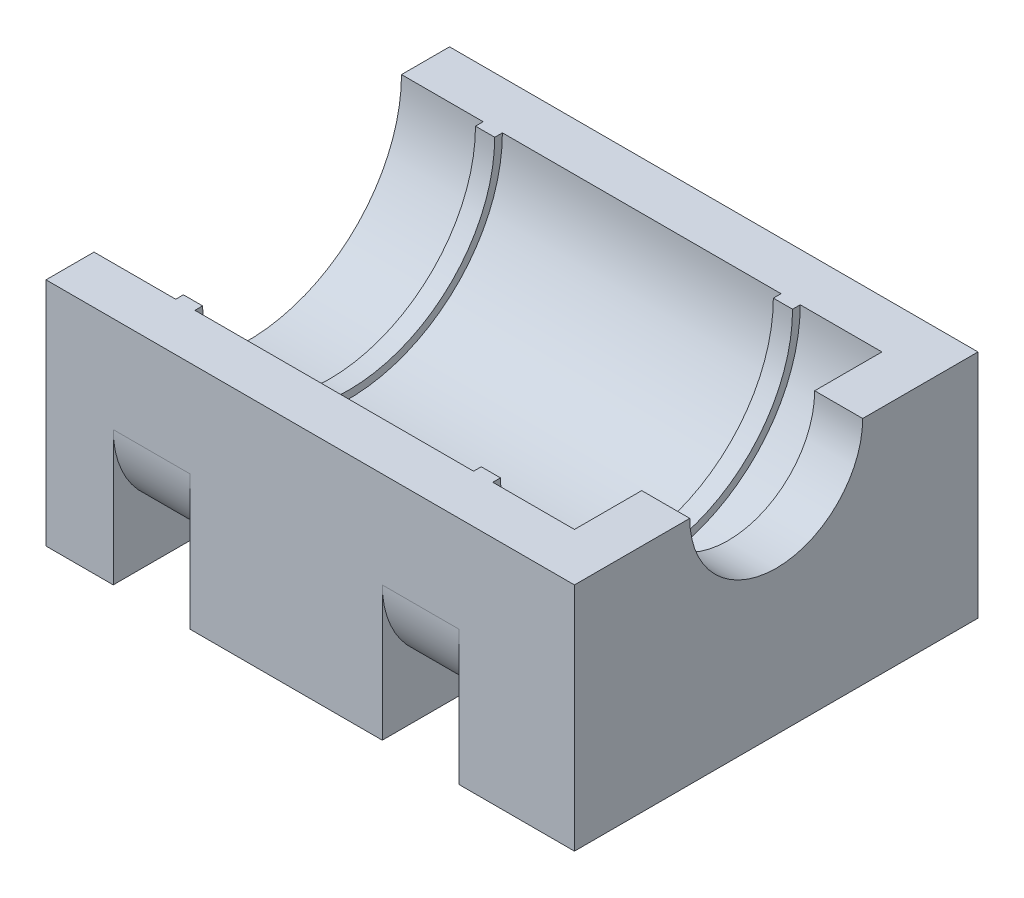
ISO-10303-21;
HEADER;
FILE_DESCRIPTION(('STEP AP214'),'2;1');
FILE_NAME('part.step','',(''),(''),'','','');
FILE_SCHEMA(('AUTOMOTIVE_DESIGN { 1 0 10303 214 1 1 1 1 }'));
ENDSEC;
DATA;
#1=APPLICATION_CONTEXT('core data for automotive mechanical design processes');
#2=APPLICATION_PROTOCOL_DEFINITION('international standard','automotive_design',2000,#1);
#3=PRODUCT_CONTEXT('',#1,'mechanical');
#4=PRODUCT('Part','Part','',(#3));
#5=PRODUCT_RELATED_PRODUCT_CATEGORY('part','',(#4));
#6=PRODUCT_DEFINITION_FORMATION('','',#4);
#7=PRODUCT_DEFINITION_CONTEXT('part definition',#1,'design');
#8=PRODUCT_DEFINITION('design','',#6,#7);
#9=PRODUCT_DEFINITION_SHAPE('','',#8);
#10=(LENGTH_UNIT() NAMED_UNIT(*) SI_UNIT(.MILLI.,.METRE.));
#11=(NAMED_UNIT(*) PLANE_ANGLE_UNIT() SI_UNIT($,.RADIAN.));
#12=(NAMED_UNIT(*) SI_UNIT($,.STERADIAN.) SOLID_ANGLE_UNIT());
#13=UNCERTAINTY_MEASURE_WITH_UNIT(LENGTH_MEASURE(1.E-05),#10,'distance_accuracy_value','');
#14=(GEOMETRIC_REPRESENTATION_CONTEXT(3) GLOBAL_UNCERTAINTY_ASSIGNED_CONTEXT((#13)) GLOBAL_UNIT_ASSIGNED_CONTEXT((#10,
#11,#12)) REPRESENTATION_CONTEXT('',''));
#15=CARTESIAN_POINT('',(0.,0.,0.));
#16=DIRECTION('',(0.,0.,1.));
#17=DIRECTION('',(1.,0.,0.));
#18=AXIS2_PLACEMENT_3D('',#15,#16,#17);
#19=CARTESIAN_POINT('',(0.,0.,0.));
#20=DIRECTION('',(0.,-1.,0.));
#21=DIRECTION('',(0.,0.,-1.));
#22=AXIS2_PLACEMENT_3D('',#19,#20,#21);
#23=PLANE('',#22);
#24=DIRECTION('',(0.,0.,1.));
#25=VECTOR('',#24,1.);
#26=CARTESIAN_POINT('',(3.75,0.,-10.5));
#27=LINE('',#26,#25);
#28=CARTESIAN_POINT('',(3.75,0.,-10.5));
#29=VERTEX_POINT('',#28);
#30=CARTESIAN_POINT('',(3.75,0.,10.5));
#31=VERTEX_POINT('',#30);
#32=EDGE_CURVE('E218',#29,#31,#27,.T.);
#33=ORIENTED_EDGE('',*,*,#32,.T.);
#34=DIRECTION('',(1.,0.,0.));
#35=VECTOR('',#34,1.);
#36=CARTESIAN_POINT('',(-13.75,0.,10.5));
#37=LINE('',#36,#35);
#38=CARTESIAN_POINT('',(-6.25,0.,10.5));
#39=VERTEX_POINT('',#38);
#40=EDGE_CURVE('E256',#39,#31,#37,.T.);
#41=ORIENTED_EDGE('',*,*,#40,.F.);
#42=DIRECTION('',(0.,0.,1.));
#43=VECTOR('',#42,1.);
#44=CARTESIAN_POINT('',(-6.25,0.,-10.5));
#45=LINE('',#44,#43);
#46=CARTESIAN_POINT('',(-6.25,0.,-10.5));
#47=VERTEX_POINT('',#46);
#48=EDGE_CURVE('E240',#47,#39,#45,.T.);
#49=ORIENTED_EDGE('',*,*,#48,.F.);
#50=DIRECTION('',(-1.,0.,0.));
#51=VECTOR('',#50,1.);
#52=CARTESIAN_POINT('',(-13.75,0.,-10.5));
#53=LINE('',#52,#51);
#54=EDGE_CURVE('E234',#29,#47,#53,.T.);
#55=ORIENTED_EDGE('',*,*,#54,.F.);
#56=EDGE_LOOP('',(#33,#41,#49,#55));
#57=FACE_BOUND('',#56,.T.);
#58=ADVANCED_FACE('F33',(#57),#23,.T.);
#59=DIRECTION('',(0.,0.,1.));
#60=VECTOR('',#59,1.);
#61=CARTESIAN_POINT('',(-10.25,0.,-10.5));
#62=LINE('',#61,#60);
#63=CARTESIAN_POINT('',(-10.25,0.,-10.5));
#64=VERTEX_POINT('',#63);
#65=CARTESIAN_POINT('',(-10.25,0.,10.5));
#66=VERTEX_POINT('',#65);
#67=EDGE_CURVE('E366',#64,#66,#62,.T.);
#68=ORIENTED_EDGE('',*,*,#67,.T.);
#69=CARTESIAN_POINT('',(-13.75,0.,10.5));
#70=VERTEX_POINT('',#69);
#71=EDGE_CURVE('E252',#70,#66,#37,.T.);
#72=ORIENTED_EDGE('',*,*,#71,.F.);
#73=DIRECTION('',(0.,0.,1.));
#74=VECTOR('',#73,1.);
#75=CARTESIAN_POINT('',(-13.75,0.,10.5));
#76=LINE('',#75,#74);
#77=CARTESIAN_POINT('',(-13.75,0.,-10.5));
#78=VERTEX_POINT('',#77);
#79=EDGE_CURVE('E245',#78,#70,#76,.T.);
#80=ORIENTED_EDGE('',*,*,#79,.F.);
#81=EDGE_CURVE('E242',#64,#78,#53,.T.);
#82=ORIENTED_EDGE('',*,*,#81,.F.);
#83=EDGE_LOOP('',(#68,#72,#80,#82));
#84=FACE_BOUND('',#83,.T.);
#85=ADVANCED_FACE('F500',(#84),#23,.T.);
#86=CARTESIAN_POINT('',(13.75,12.,10.5));
#87=DIRECTION('',(-1.,0.,0.));
#88=DIRECTION('',(0.,0.,1.));
#89=AXIS2_PLACEMENT_3D('',#86,#87,#88);
#90=PLANE('',#89);
#91=CARTESIAN_POINT('',(13.75,12.,0.));
#92=DIRECTION('',(-1.,0.,0.));
#93=DIRECTION('',(0.,0.,1.));
#94=AXIS2_PLACEMENT_3D('',#91,#92,#93);
#95=CIRCLE('',#94,4.5);
#96=CARTESIAN_POINT('',(13.75,12.,-4.5));
#97=VERTEX_POINT('',#96);
#98=CARTESIAN_POINT('',(13.75,12.,4.5));
#99=VERTEX_POINT('',#98);
#100=EDGE_CURVE('E410',#97,#99,#95,.T.);
#101=ORIENTED_EDGE('',*,*,#100,.T.);
#102=DIRECTION('',(0.,0.,-1.));
#103=VECTOR('',#102,1.);
#104=CARTESIAN_POINT('',(13.75,12.,10.5));
#105=LINE('',#104,#103);
#106=CARTESIAN_POINT('',(13.75,12.,10.5));
#107=VERTEX_POINT('',#106);
#108=EDGE_CURVE('E413',#107,#99,#105,.T.);
#109=ORIENTED_EDGE('',*,*,#108,.F.);
#110=DIRECTION('',(0.,-1.,0.));
#111=VECTOR('',#110,1.);
#112=CARTESIAN_POINT('',(13.75,12.,10.5));
#113=LINE('',#112,#111);
#114=CARTESIAN_POINT('',(13.75,0.,10.5));
#115=VERTEX_POINT('',#114);
#116=EDGE_CURVE('E257',#107,#115,#113,.T.);
#117=ORIENTED_EDGE('',*,*,#116,.T.);
#118=DIRECTION('',(0.,0.,-1.));
#119=VECTOR('',#118,1.);
#120=CARTESIAN_POINT('',(13.75,0.,10.5));
#121=LINE('',#120,#119);
#122=CARTESIAN_POINT('',(13.75,0.,-10.5));
#123=VERTEX_POINT('',#122);
#124=EDGE_CURVE('E246',#115,#123,#121,.T.);
#125=ORIENTED_EDGE('',*,*,#124,.T.);
#126=DIRECTION('',(0.,-1.,0.));
#127=VECTOR('',#126,1.);
#128=CARTESIAN_POINT('',(13.75,12.,-10.5));
#129=LINE('',#128,#127);
#130=CARTESIAN_POINT('',(13.75,12.,-10.5));
#131=VERTEX_POINT('',#130);
#132=EDGE_CURVE('E267',#131,#123,#129,.T.);
#133=ORIENTED_EDGE('',*,*,#132,.F.);
#134=EDGE_CURVE('E255',#97,#131,#105,.T.);
#135=ORIENTED_EDGE('',*,*,#134,.F.);
#136=EDGE_LOOP('',(#101,#109,#117,#125,#133,#135));
#137=FACE_BOUND('',#136,.T.);
#138=ADVANCED_FACE('F437',(#137),#90,.F.);
#139=CARTESIAN_POINT('',(-13.75,12.,10.5));
#140=DIRECTION('',(1.,0.,0.));
#141=DIRECTION('',(0.,0.,-1.));
#142=AXIS2_PLACEMENT_3D('',#139,#140,#141);
#143=PLANE('',#142);
#144=CARTESIAN_POINT('',(-13.75,12.,0.));
#145=DIRECTION('',(-1.,0.,0.));
#146=DIRECTION('',(0.,0.,1.));
#147=AXIS2_PLACEMENT_3D('',#144,#145,#146);
#148=CIRCLE('',#147,8.);
#149=CARTESIAN_POINT('',(-13.75,12.,-8.));
#150=VERTEX_POINT('',#149);
#151=CARTESIAN_POINT('',(-13.75,12.,7.99999999999999));
#152=VERTEX_POINT('',#151);
#153=EDGE_CURVE('E372',#150,#152,#148,.T.);
#154=ORIENTED_EDGE('',*,*,#153,.F.);
#155=DIRECTION('',(0.,0.,1.));
#156=VECTOR('',#155,1.);
#157=CARTESIAN_POINT('',(-13.75,12.,10.5));
#158=LINE('',#157,#156);
#159=CARTESIAN_POINT('',(-13.75,12.,-10.5));
#160=VERTEX_POINT('',#159);
#161=EDGE_CURVE('E419',#160,#150,#158,.T.);
#162=ORIENTED_EDGE('',*,*,#161,.F.);
#163=DIRECTION('',(0.,-1.,0.));
#164=VECTOR('',#163,1.);
#165=CARTESIAN_POINT('',(-13.75,12.,-10.5));
#166=LINE('',#165,#164);
#167=EDGE_CURVE('E264',#160,#78,#166,.T.);
#168=ORIENTED_EDGE('',*,*,#167,.T.);
#169=ORIENTED_EDGE('',*,*,#79,.T.);
#170=DIRECTION('',(0.,-1.,0.));
#171=VECTOR('',#170,1.);
#172=CARTESIAN_POINT('',(-13.75,12.,10.5));
#173=LINE('',#172,#171);
#174=CARTESIAN_POINT('',(-13.75,12.,10.5));
#175=VERTEX_POINT('',#174);
#176=EDGE_CURVE('E260',#175,#70,#173,.T.);
#177=ORIENTED_EDGE('',*,*,#176,.F.);
#178=EDGE_CURVE('E418',#152,#175,#158,.T.);
#179=ORIENTED_EDGE('',*,*,#178,.F.);
#180=EDGE_LOOP('',(#154,#162,#168,#169,#177,#179));
#181=FACE_BOUND('',#180,.T.);
#182=ADVANCED_FACE('F495',(#181),#143,.F.);
#183=CARTESIAN_POINT('',(0.,12.,0.));
#184=DIRECTION('',(0.,-1.,0.));
#185=DIRECTION('',(0.,0.,-1.));
#186=AXIS2_PLACEMENT_3D('',#183,#184,#185);
#187=PLANE('',#186);
#188=DIRECTION('',(-1.,0.,0.));
#189=VECTOR('',#188,1.);
#190=CARTESIAN_POINT('',(-13.75,12.,4.5));
#191=LINE('',#190,#189);
#192=CARTESIAN_POINT('',(11.25,12.,4.5));
#193=VERTEX_POINT('',#192);
#194=EDGE_CURVE('E308',#193,#99,#191,.F.);
#195=ORIENTED_EDGE('',*,*,#194,.F.);
#196=DIRECTION('',(0.,0.,-1.));
#197=VECTOR('',#196,1.);
#198=CARTESIAN_POINT('',(11.25,12.,0.));
#199=LINE('',#198,#197);
#200=CARTESIAN_POINT('',(11.25,12.,8.));
#201=VERTEX_POINT('',#200);
#202=EDGE_CURVE('E296',#201,#193,#199,.T.);
#203=ORIENTED_EDGE('',*,*,#202,.F.);
#204=DIRECTION('',(-1.,0.,0.));
#205=VECTOR('',#204,1.);
#206=CARTESIAN_POINT('',(-13.75,12.,8.));
#207=LINE('',#206,#205);
#208=CARTESIAN_POINT('',(7.,12.,8.));
#209=VERTEX_POINT('',#208);
#210=EDGE_CURVE('E306',#209,#201,#207,.F.);
#211=ORIENTED_EDGE('',*,*,#210,.F.);
#212=DIRECTION('',(0.,0.,1.));
#213=VECTOR('',#212,1.);
#214=CARTESIAN_POINT('',(7.,12.,0.));
#215=LINE('',#214,#213);
#216=CARTESIAN_POINT('',(7.,12.,7.6));
#217=VERTEX_POINT('',#216);
#218=EDGE_CURVE('E291',#217,#209,#215,.T.);
#219=ORIENTED_EDGE('',*,*,#218,.F.);
#220=DIRECTION('',(-1.,0.,0.));
#221=VECTOR('',#220,1.);
#222=CARTESIAN_POINT('',(-13.75,12.,7.6));
#223=LINE('',#222,#221);
#224=CARTESIAN_POINT('',(6.,12.,7.6));
#225=VERTEX_POINT('',#224);
#226=EDGE_CURVE('E304',#225,#217,#223,.F.);
#227=ORIENTED_EDGE('',*,*,#226,.F.);
#228=DIRECTION('',(0.,0.,-1.));
#229=VECTOR('',#228,1.);
#230=CARTESIAN_POINT('',(6.,12.,0.));
#231=LINE('',#230,#229);
#232=CARTESIAN_POINT('',(6.,12.,8.));
#233=VERTEX_POINT('',#232);
#234=EDGE_CURVE('E286',#233,#225,#231,.T.);
#235=ORIENTED_EDGE('',*,*,#234,.F.);
#236=DIRECTION('',(-1.,0.,0.));
#237=VECTOR('',#236,1.);
#238=CARTESIAN_POINT('',(-13.75,12.,8.));
#239=LINE('',#238,#237);
#240=CARTESIAN_POINT('',(-8.5,12.,8.));
#241=VERTEX_POINT('',#240);
#242=EDGE_CURVE('E302',#241,#233,#239,.F.);
#243=ORIENTED_EDGE('',*,*,#242,.F.);
#244=DIRECTION('',(0.,0.,1.));
#245=VECTOR('',#244,1.);
#246=CARTESIAN_POINT('',(-8.5,12.,0.));
#247=LINE('',#246,#245);
#248=CARTESIAN_POINT('',(-8.5,12.,7.6));
#249=VERTEX_POINT('',#248);
#250=EDGE_CURVE('E281',#249,#241,#247,.T.);
#251=ORIENTED_EDGE('',*,*,#250,.F.);
#252=DIRECTION('',(-1.,0.,0.));
#253=VECTOR('',#252,1.);
#254=CARTESIAN_POINT('',(-13.75,12.,7.6));
#255=LINE('',#254,#253);
#256=CARTESIAN_POINT('',(-9.5,12.,7.6));
#257=VERTEX_POINT('',#256);
#258=EDGE_CURVE('E300',#257,#249,#255,.F.);
#259=ORIENTED_EDGE('',*,*,#258,.F.);
#260=DIRECTION('',(0.,0.,-1.));
#261=VECTOR('',#260,1.);
#262=CARTESIAN_POINT('',(-9.5,12.,0.));
#263=LINE('',#262,#261);
#264=CARTESIAN_POINT('',(-9.5,12.,8.));
#265=VERTEX_POINT('',#264);
#266=EDGE_CURVE('E276',#265,#257,#263,.T.);
#267=ORIENTED_EDGE('',*,*,#266,.F.);
#268=DIRECTION('',(-1.,0.,0.));
#269=VECTOR('',#268,1.);
#270=CARTESIAN_POINT('',(-13.75,12.,7.99999999999999));
#271=LINE('',#270,#269);
#272=EDGE_CURVE('E298',#152,#265,#271,.F.);
#273=ORIENTED_EDGE('',*,*,#272,.F.);
#274=ORIENTED_EDGE('',*,*,#178,.T.);
#275=DIRECTION('',(1.,0.,0.));
#276=VECTOR('',#275,1.);
#277=CARTESIAN_POINT('',(-13.75,12.,10.5));
#278=LINE('',#277,#276);
#279=EDGE_CURVE('E261',#175,#107,#278,.T.);
#280=ORIENTED_EDGE('',*,*,#279,.T.);
#281=ORIENTED_EDGE('',*,*,#108,.T.);
#282=EDGE_LOOP('',(#195,#203,#211,#219,#227,#235,#243,#251,#259,#267,#273,#274,#280,#281));
#283=FACE_BOUND('',#282,.T.);
#284=ADVANCED_FACE('F425',(#283),#187,.F.);
#285=DIRECTION('',(-1.,0.,0.));
#286=VECTOR('',#285,1.);
#287=CARTESIAN_POINT('',(-13.75,12.,-4.5));
#288=LINE('',#287,#286);
#289=CARTESIAN_POINT('',(11.25,12.,-4.5));
#290=VERTEX_POINT('',#289);
#291=EDGE_CURVE('E295',#97,#290,#288,.T.);
#292=ORIENTED_EDGE('',*,*,#291,.F.);
#293=ORIENTED_EDGE('',*,*,#134,.T.);
#294=DIRECTION('',(-1.,0.,0.));
#295=VECTOR('',#294,1.);
#296=CARTESIAN_POINT('',(-13.75,12.,-10.5));
#297=LINE('',#296,#295);
#298=EDGE_CURVE('E416',#131,#160,#297,.T.);
#299=ORIENTED_EDGE('',*,*,#298,.T.);
#300=ORIENTED_EDGE('',*,*,#161,.T.);
#301=DIRECTION('',(-1.,0.,0.));
#302=VECTOR('',#301,1.);
#303=CARTESIAN_POINT('',(-13.75,12.,-8.));
#304=LINE('',#303,#302);
#305=CARTESIAN_POINT('',(-9.5,12.,-8.));
#306=VERTEX_POINT('',#305);
#307=EDGE_CURVE('E270',#306,#150,#304,.T.);
#308=ORIENTED_EDGE('',*,*,#307,.F.);
#309=CARTESIAN_POINT('',(-9.5,12.,-7.6));
#310=VERTEX_POINT('',#309);
#311=EDGE_CURVE('E272',#310,#306,#263,.T.);
#312=ORIENTED_EDGE('',*,*,#311,.F.);
#313=DIRECTION('',(-1.,0.,0.));
#314=VECTOR('',#313,1.);
#315=CARTESIAN_POINT('',(-13.75,12.,-7.6));
#316=LINE('',#315,#314);
#317=CARTESIAN_POINT('',(-8.5,12.,-7.6));
#318=VERTEX_POINT('',#317);
#319=EDGE_CURVE('E275',#318,#310,#316,.T.);
#320=ORIENTED_EDGE('',*,*,#319,.F.);
#321=CARTESIAN_POINT('',(-8.5,12.,-8.));
#322=VERTEX_POINT('',#321);
#323=EDGE_CURVE('E278',#322,#318,#247,.T.);
#324=ORIENTED_EDGE('',*,*,#323,.F.);
#325=DIRECTION('',(-1.,0.,0.));
#326=VECTOR('',#325,1.);
#327=CARTESIAN_POINT('',(-13.75,12.,-8.));
#328=LINE('',#327,#326);
#329=CARTESIAN_POINT('',(6.,12.,-8.));
#330=VERTEX_POINT('',#329);
#331=EDGE_CURVE('E280',#330,#322,#328,.T.);
#332=ORIENTED_EDGE('',*,*,#331,.F.);
#333=CARTESIAN_POINT('',(6.,12.,-7.6));
#334=VERTEX_POINT('',#333);
#335=EDGE_CURVE('E283',#334,#330,#231,.T.);
#336=ORIENTED_EDGE('',*,*,#335,.F.);
#337=DIRECTION('',(-1.,0.,0.));
#338=VECTOR('',#337,1.);
#339=CARTESIAN_POINT('',(-13.75,12.,-7.6));
#340=LINE('',#339,#338);
#341=CARTESIAN_POINT('',(7.,12.,-7.6));
#342=VERTEX_POINT('',#341);
#343=EDGE_CURVE('E285',#342,#334,#340,.T.);
#344=ORIENTED_EDGE('',*,*,#343,.F.);
#345=CARTESIAN_POINT('',(7.,12.,-8.));
#346=VERTEX_POINT('',#345);
#347=EDGE_CURVE('E288',#346,#342,#215,.T.);
#348=ORIENTED_EDGE('',*,*,#347,.F.);
#349=DIRECTION('',(-1.,0.,0.));
#350=VECTOR('',#349,1.);
#351=CARTESIAN_POINT('',(-13.75,12.,-8.));
#352=LINE('',#351,#350);
#353=CARTESIAN_POINT('',(11.25,12.,-8.));
#354=VERTEX_POINT('',#353);
#355=EDGE_CURVE('E290',#354,#346,#352,.T.);
#356=ORIENTED_EDGE('',*,*,#355,.F.);
#357=EDGE_CURVE('E293',#290,#354,#199,.T.);
#358=ORIENTED_EDGE('',*,*,#357,.F.);
#359=EDGE_LOOP('',(#292,#293,#299,#300,#308,#312,#320,#324,#332,#336,#344,#348,#356,#358));
#360=FACE_BOUND('',#359,.T.);
#361=ADVANCED_FACE('F446',(#360),#187,.F.);
#362=CARTESIAN_POINT('',(-13.75,12.,-10.5));
#363=DIRECTION('',(0.,0.,1.));
#364=DIRECTION('',(1.,0.,0.));
#365=AXIS2_PLACEMENT_3D('',#362,#363,#364);
#366=PLANE('',#365);
#367=DIRECTION('',(-1.,0.,0.));
#368=VECTOR('',#367,1.);
#369=CARTESIAN_POINT('',(-13.75,7.,-10.5));
#370=LINE('',#369,#368);
#371=CARTESIAN_POINT('',(-6.25,7.,-10.5));
#372=VERTEX_POINT('',#371);
#373=CARTESIAN_POINT('',(-10.25,7.,-10.5));
#374=VERTEX_POINT('',#373);
#375=EDGE_CURVE('E327',#372,#374,#370,.T.);
#376=ORIENTED_EDGE('',*,*,#375,.T.);
#377=DIRECTION('',(0.,-1.,0.));
#378=VECTOR('',#377,1.);
#379=CARTESIAN_POINT('',(-10.25,0.,-10.5));
#380=LINE('',#379,#378);
#381=EDGE_CURVE('E48',#374,#64,#380,.T.);
#382=ORIENTED_EDGE('',*,*,#381,.T.);
#383=ORIENTED_EDGE('',*,*,#81,.T.);
#384=ORIENTED_EDGE('',*,*,#167,.F.);
#385=ORIENTED_EDGE('',*,*,#298,.F.);
#386=ORIENTED_EDGE('',*,*,#132,.T.);
#387=CARTESIAN_POINT('',(7.75,0.,-10.5));
#388=VERTEX_POINT('',#387);
#389=EDGE_CURVE('E241',#123,#388,#53,.T.);
#390=ORIENTED_EDGE('',*,*,#389,.T.);
#391=DIRECTION('',(0.,1.,0.));
#392=VECTOR('',#391,1.);
#393=CARTESIAN_POINT('',(7.75,0.,-10.5));
#394=LINE('',#393,#392);
#395=CARTESIAN_POINT('',(7.75,7.,-10.5));
#396=VERTEX_POINT('',#395);
#397=EDGE_CURVE('E230',#388,#396,#394,.T.);
#398=ORIENTED_EDGE('',*,*,#397,.T.);
#399=DIRECTION('',(-1.,0.,0.));
#400=VECTOR('',#399,1.);
#401=CARTESIAN_POINT('',(-13.75,7.,-10.5));
#402=LINE('',#401,#400);
#403=CARTESIAN_POINT('',(3.75,7.,-10.5));
#404=VERTEX_POINT('',#403);
#405=EDGE_CURVE('E236',#396,#404,#402,.T.);
#406=ORIENTED_EDGE('',*,*,#405,.T.);
#407=DIRECTION('',(0.,-1.,0.));
#408=VECTOR('',#407,1.);
#409=CARTESIAN_POINT('',(3.75,0.,-10.5));
#410=LINE('',#409,#408);
#411=EDGE_CURVE('E221',#404,#29,#410,.T.);
#412=ORIENTED_EDGE('',*,*,#411,.T.);
#413=ORIENTED_EDGE('',*,*,#54,.T.);
#414=DIRECTION('',(0.,1.,0.));
#415=VECTOR('',#414,1.);
#416=CARTESIAN_POINT('',(-6.25,0.,-10.5));
#417=LINE('',#416,#415);
#418=EDGE_CURVE('E56',#47,#372,#417,.T.);
#419=ORIENTED_EDGE('',*,*,#418,.T.);
#420=EDGE_LOOP('',(#376,#382,#383,#384,#385,#386,#390,#398,#406,#412,#413,#419));
#421=FACE_BOUND('',#420,.T.);
#422=ADVANCED_FACE('F233',(#421),#366,.F.);
#423=CARTESIAN_POINT('',(-13.75,12.,10.5));
#424=DIRECTION('',(0.,0.,-1.));
#425=DIRECTION('',(-1.,0.,0.));
#426=AXIS2_PLACEMENT_3D('',#423,#424,#425);
#427=PLANE('',#426);
#428=DIRECTION('',(0.,-1.,0.));
#429=VECTOR('',#428,1.);
#430=CARTESIAN_POINT('',(-10.25,0.,10.5));
#431=LINE('',#430,#429);
#432=CARTESIAN_POINT('',(-10.25,7.,10.5));
#433=VERTEX_POINT('',#432);
#434=EDGE_CURVE('E351',#433,#66,#431,.T.);
#435=ORIENTED_EDGE('',*,*,#434,.F.);
#436=DIRECTION('',(-1.,0.,0.));
#437=VECTOR('',#436,1.);
#438=CARTESIAN_POINT('',(-13.75,7.,10.5));
#439=LINE('',#438,#437);
#440=CARTESIAN_POINT('',(-6.25,7.,10.5));
#441=VERTEX_POINT('',#440);
#442=EDGE_CURVE('E318',#433,#441,#439,.F.);
#443=ORIENTED_EDGE('',*,*,#442,.T.);
#444=DIRECTION('',(0.,1.,0.));
#445=VECTOR('',#444,1.);
#446=CARTESIAN_POINT('',(-6.25,0.,10.5));
#447=LINE('',#446,#445);
#448=EDGE_CURVE('E364',#39,#441,#447,.T.);
#449=ORIENTED_EDGE('',*,*,#448,.F.);
#450=ORIENTED_EDGE('',*,*,#40,.T.);
#451=DIRECTION('',(0.,-1.,0.));
#452=VECTOR('',#451,1.);
#453=CARTESIAN_POINT('',(3.75,0.,10.5));
#454=LINE('',#453,#452);
#455=CARTESIAN_POINT('',(3.75,7.,10.5));
#456=VERTEX_POINT('',#455);
#457=EDGE_CURVE('E224',#456,#31,#454,.T.);
#458=ORIENTED_EDGE('',*,*,#457,.F.);
#459=DIRECTION('',(-1.,0.,0.));
#460=VECTOR('',#459,1.);
#461=CARTESIAN_POINT('',(-13.75,7.,10.5));
#462=LINE('',#461,#460);
#463=CARTESIAN_POINT('',(7.75,7.,10.5));
#464=VERTEX_POINT('',#463);
#465=EDGE_CURVE('E315',#456,#464,#462,.F.);
#466=ORIENTED_EDGE('',*,*,#465,.T.);
#467=DIRECTION('',(0.,1.,0.));
#468=VECTOR('',#467,1.);
#469=CARTESIAN_POINT('',(7.75,0.,10.5));
#470=LINE('',#469,#468);
#471=CARTESIAN_POINT('',(7.75,0.,10.5));
#472=VERTEX_POINT('',#471);
#473=EDGE_CURVE('E237',#472,#464,#470,.T.);
#474=ORIENTED_EDGE('',*,*,#473,.F.);
#475=EDGE_CURVE('E251',#472,#115,#37,.T.);
#476=ORIENTED_EDGE('',*,*,#475,.T.);
#477=ORIENTED_EDGE('',*,*,#116,.F.);
#478=ORIENTED_EDGE('',*,*,#279,.F.);
#479=ORIENTED_EDGE('',*,*,#176,.T.);
#480=ORIENTED_EDGE('',*,*,#71,.T.);
#481=EDGE_LOOP('',(#435,#443,#449,#450,#458,#466,#474,#476,#477,#478,#479,#480));
#482=FACE_BOUND('',#481,.T.);
#483=ADVANCED_FACE('F431',(#482),#427,.F.);
#484=DIRECTION('',(0.,0.,1.));
#485=VECTOR('',#484,1.);
#486=CARTESIAN_POINT('',(7.75,0.,-10.5));
#487=LINE('',#486,#485);
#488=EDGE_CURVE('E229',#388,#472,#487,.T.);
#489=ORIENTED_EDGE('',*,*,#488,.F.);
#490=ORIENTED_EDGE('',*,*,#389,.F.);
#491=ORIENTED_EDGE('',*,*,#124,.F.);
#492=ORIENTED_EDGE('',*,*,#475,.F.);
#493=EDGE_LOOP('',(#489,#490,#491,#492));
#494=FACE_BOUND('',#493,.T.);
#495=ADVANCED_FACE('F532',(#494),#23,.T.);
#496=CARTESIAN_POINT('',(-13.75,12.,0.));
#497=DIRECTION('',(-1.,0.,0.));
#498=DIRECTION('',(0.,0.,1.));
#499=AXIS2_PLACEMENT_3D('',#496,#497,#498);
#500=CYLINDRICAL_SURFACE('',#499,4.5);
#501=ORIENTED_EDGE('',*,*,#194,.T.);
#502=ORIENTED_EDGE('',*,*,#100,.F.);
#503=ORIENTED_EDGE('',*,*,#291,.T.);
#504=CARTESIAN_POINT('',(11.25,12.,0.));
#505=DIRECTION('',(-1.,0.,0.));
#506=DIRECTION('',(0.,0.,1.));
#507=AXIS2_PLACEMENT_3D('',#504,#505,#506);
#508=CIRCLE('',#507,4.5);
#509=EDGE_CURVE('E407',#290,#193,#508,.T.);
#510=ORIENTED_EDGE('',*,*,#509,.T.);
#511=EDGE_LOOP('',(#501,#502,#503,#510));
#512=FACE_BOUND('',#511,.T.);
#513=ADVANCED_FACE('F442',(#512),#500,.F.);
#514=CARTESIAN_POINT('',(11.25,12.,-4.5));
#515=DIRECTION('',(-1.,0.,0.));
#516=DIRECTION('',(0.,0.,1.));
#517=AXIS2_PLACEMENT_3D('',#514,#515,#516);
#518=PLANE('',#517);
#519=ORIENTED_EDGE('',*,*,#202,.T.);
#520=ORIENTED_EDGE('',*,*,#509,.F.);
#521=ORIENTED_EDGE('',*,*,#357,.T.);
#522=CARTESIAN_POINT('',(11.25,12.,0.));
#523=DIRECTION('',(-1.,0.,0.));
#524=DIRECTION('',(0.,0.,1.));
#525=AXIS2_PLACEMENT_3D('',#522,#523,#524);
#526=CIRCLE('',#525,8.);
#527=EDGE_CURVE('E404',#354,#201,#526,.T.);
#528=ORIENTED_EDGE('',*,*,#527,.T.);
#529=EDGE_LOOP('',(#519,#520,#521,#528));
#530=FACE_BOUND('',#529,.T.);
#531=ADVANCED_FACE('F452',(#530),#518,.T.);
#532=CARTESIAN_POINT('',(-13.75,12.,0.));
#533=DIRECTION('',(-1.,0.,0.));
#534=DIRECTION('',(0.,0.,1.));
#535=AXIS2_PLACEMENT_3D('',#532,#533,#534);
#536=CYLINDRICAL_SURFACE('',#535,8.);
#537=ORIENTED_EDGE('',*,*,#210,.T.);
#538=ORIENTED_EDGE('',*,*,#527,.F.);
#539=ORIENTED_EDGE('',*,*,#355,.T.);
#540=CARTESIAN_POINT('',(7.,12.,0.));
#541=DIRECTION('',(-1.,0.,0.));
#542=DIRECTION('',(0.,0.,1.));
#543=AXIS2_PLACEMENT_3D('',#540,#541,#542);
#544=CIRCLE('',#543,8.);
#545=EDGE_CURVE('E401',#346,#209,#544,.T.);
#546=ORIENTED_EDGE('',*,*,#545,.T.);
#547=EDGE_LOOP('',(#537,#538,#539,#546));
#548=FACE_BOUND('',#547,.T.);
#549=ADVANCED_FACE('F455',(#548),#536,.F.);
#550=CARTESIAN_POINT('',(7.,12.,-8.));
#551=DIRECTION('',(1.,0.,0.));
#552=DIRECTION('',(0.,0.,-1.));
#553=AXIS2_PLACEMENT_3D('',#550,#551,#552);
#554=PLANE('',#553);
#555=ORIENTED_EDGE('',*,*,#347,.T.);
#556=CARTESIAN_POINT('',(7.,12.,0.));
#557=DIRECTION('',(-1.,0.,0.));
#558=DIRECTION('',(0.,0.,1.));
#559=AXIS2_PLACEMENT_3D('',#556,#557,#558);
#560=CIRCLE('',#559,7.6);
#561=EDGE_CURVE('E398',#342,#217,#560,.T.);
#562=ORIENTED_EDGE('',*,*,#561,.T.);
#563=ORIENTED_EDGE('',*,*,#218,.T.);
#564=ORIENTED_EDGE('',*,*,#545,.F.);
#565=EDGE_LOOP('',(#555,#562,#563,#564));
#566=FACE_BOUND('',#565,.T.);
#567=ADVANCED_FACE('F462',(#566),#554,.T.);
#568=CARTESIAN_POINT('',(-13.75,12.,0.));
#569=DIRECTION('',(-1.,0.,0.));
#570=DIRECTION('',(0.,0.,1.));
#571=AXIS2_PLACEMENT_3D('',#568,#569,#570);
#572=CYLINDRICAL_SURFACE('',#571,7.6);
#573=ORIENTED_EDGE('',*,*,#226,.T.);
#574=ORIENTED_EDGE('',*,*,#561,.F.);
#575=ORIENTED_EDGE('',*,*,#343,.T.);
#576=CARTESIAN_POINT('',(6.,12.,0.));
#577=DIRECTION('',(-1.,0.,0.));
#578=DIRECTION('',(0.,0.,1.));
#579=AXIS2_PLACEMENT_3D('',#576,#577,#578);
#580=CIRCLE('',#579,7.6);
#581=EDGE_CURVE('E395',#334,#225,#580,.T.);
#582=ORIENTED_EDGE('',*,*,#581,.T.);
#583=EDGE_LOOP('',(#573,#574,#575,#582));
#584=FACE_BOUND('',#583,.T.);
#585=ADVANCED_FACE('F466',(#584),#572,.F.);
#586=CARTESIAN_POINT('',(6.,12.,-7.6));
#587=DIRECTION('',(-1.,0.,0.));
#588=DIRECTION('',(0.,0.,1.));
#589=AXIS2_PLACEMENT_3D('',#586,#587,#588);
#590=PLANE('',#589);
#591=ORIENTED_EDGE('',*,*,#234,.T.);
#592=ORIENTED_EDGE('',*,*,#581,.F.);
#593=ORIENTED_EDGE('',*,*,#335,.T.);
#594=CARTESIAN_POINT('',(6.,12.,0.));
#595=DIRECTION('',(-1.,0.,0.));
#596=DIRECTION('',(0.,0.,1.));
#597=AXIS2_PLACEMENT_3D('',#594,#595,#596);
#598=CIRCLE('',#597,8.);
#599=EDGE_CURVE('E392',#330,#233,#598,.T.);
#600=ORIENTED_EDGE('',*,*,#599,.T.);
#601=EDGE_LOOP('',(#591,#592,#593,#600));
#602=FACE_BOUND('',#601,.T.);
#603=ADVANCED_FACE('F473',(#602),#590,.T.);
#604=CARTESIAN_POINT('',(-13.75,12.,0.));
#605=DIRECTION('',(-1.,0.,0.));
#606=DIRECTION('',(0.,0.,1.));
#607=AXIS2_PLACEMENT_3D('',#604,#605,#606);
#608=CYLINDRICAL_SURFACE('',#607,8.);
#609=ORIENTED_EDGE('',*,*,#242,.T.);
#610=ORIENTED_EDGE('',*,*,#599,.F.);
#611=ORIENTED_EDGE('',*,*,#331,.T.);
#612=CARTESIAN_POINT('',(-8.5,12.,0.));
#613=DIRECTION('',(-1.,0.,0.));
#614=DIRECTION('',(0.,0.,1.));
#615=AXIS2_PLACEMENT_3D('',#612,#613,#614);
#616=CIRCLE('',#615,8.);
#617=EDGE_CURVE('E389',#322,#241,#616,.T.);
#618=ORIENTED_EDGE('',*,*,#617,.T.);
#619=EDGE_LOOP('',(#609,#610,#611,#618));
#620=FACE_BOUND('',#619,.T.);
#621=ADVANCED_FACE('F475',(#620),#608,.F.);
#622=CARTESIAN_POINT('',(-8.5,12.,-8.));
#623=DIRECTION('',(1.,0.,0.));
#624=DIRECTION('',(0.,0.,-1.));
#625=AXIS2_PLACEMENT_3D('',#622,#623,#624);
#626=PLANE('',#625);
#627=ORIENTED_EDGE('',*,*,#323,.T.);
#628=CARTESIAN_POINT('',(-8.5,12.,0.));
#629=DIRECTION('',(-1.,0.,0.));
#630=DIRECTION('',(0.,0.,1.));
#631=AXIS2_PLACEMENT_3D('',#628,#629,#630);
#632=CIRCLE('',#631,7.6);
#633=EDGE_CURVE('E386',#318,#249,#632,.T.);
#634=ORIENTED_EDGE('',*,*,#633,.T.);
#635=ORIENTED_EDGE('',*,*,#250,.T.);
#636=ORIENTED_EDGE('',*,*,#617,.F.);
#637=EDGE_LOOP('',(#627,#634,#635,#636));
#638=FACE_BOUND('',#637,.T.);
#639=ADVANCED_FACE('F482',(#638),#626,.T.);
#640=CARTESIAN_POINT('',(-13.75,12.,0.));
#641=DIRECTION('',(-1.,0.,0.));
#642=DIRECTION('',(0.,0.,1.));
#643=AXIS2_PLACEMENT_3D('',#640,#641,#642);
#644=CYLINDRICAL_SURFACE('',#643,7.6);
#645=ORIENTED_EDGE('',*,*,#258,.T.);
#646=ORIENTED_EDGE('',*,*,#633,.F.);
#647=ORIENTED_EDGE('',*,*,#319,.T.);
#648=CARTESIAN_POINT('',(-9.5,12.,0.));
#649=DIRECTION('',(-1.,0.,0.));
#650=DIRECTION('',(0.,0.,1.));
#651=AXIS2_PLACEMENT_3D('',#648,#649,#650);
#652=CIRCLE('',#651,7.6);
#653=EDGE_CURVE('E383',#310,#257,#652,.T.);
#654=ORIENTED_EDGE('',*,*,#653,.T.);
#655=EDGE_LOOP('',(#645,#646,#647,#654));
#656=FACE_BOUND('',#655,.T.);
#657=ADVANCED_FACE('F486',(#656),#644,.F.);
#658=CARTESIAN_POINT('',(-9.5,12.,-7.6));
#659=DIRECTION('',(-1.,0.,0.));
#660=DIRECTION('',(0.,0.,1.));
#661=AXIS2_PLACEMENT_3D('',#658,#659,#660);
#662=PLANE('',#661);
#663=ORIENTED_EDGE('',*,*,#266,.T.);
#664=ORIENTED_EDGE('',*,*,#653,.F.);
#665=ORIENTED_EDGE('',*,*,#311,.T.);
#666=CARTESIAN_POINT('',(-9.5,12.,0.));
#667=DIRECTION('',(-1.,0.,0.));
#668=DIRECTION('',(0.,0.,1.));
#669=AXIS2_PLACEMENT_3D('',#666,#667,#668);
#670=CIRCLE('',#669,8.);
#671=EDGE_CURVE('E380',#306,#265,#670,.T.);
#672=ORIENTED_EDGE('',*,*,#671,.T.);
#673=EDGE_LOOP('',(#663,#664,#665,#672));
#674=FACE_BOUND('',#673,.T.);
#675=ADVANCED_FACE('F491',(#674),#662,.T.);
#676=CARTESIAN_POINT('',(-13.75,12.,0.));
#677=DIRECTION('',(-1.,0.,0.));
#678=DIRECTION('',(0.,0.,1.));
#679=AXIS2_PLACEMENT_3D('',#676,#677,#678);
#680=CYLINDRICAL_SURFACE('',#679,8.);
#681=ORIENTED_EDGE('',*,*,#272,.T.);
#682=ORIENTED_EDGE('',*,*,#671,.F.);
#683=ORIENTED_EDGE('',*,*,#307,.T.);
#684=ORIENTED_EDGE('',*,*,#153,.T.);
#685=EDGE_LOOP('',(#681,#682,#683,#684));
#686=FACE_BOUND('',#685,.T.);
#687=ADVANCED_FACE('F588',(#686),#680,.F.);
#688=CARTESIAN_POINT('',(-10.25,0.,-10.5));
#689=DIRECTION('',(-1.,0.,0.));
#690=DIRECTION('',(0.,0.,1.));
#691=AXIS2_PLACEMENT_3D('',#688,#689,#690);
#692=PLANE('',#691);
#693=ORIENTED_EDGE('',*,*,#434,.T.);
#694=ORIENTED_EDGE('',*,*,#67,.F.);
#695=ORIENTED_EDGE('',*,*,#381,.F.);
#696=CARTESIAN_POINT('',(-10.25,7.,-5.5));
#697=DIRECTION('',(-1.,0.,0.));
#698=DIRECTION('',(0.,0.,1.));
#699=AXIS2_PLACEMENT_3D('',#696,#697,#698);
#700=CIRCLE('',#699,5.);
#701=CARTESIAN_POINT('',(-10.25,2.,-5.5));
#702=VERTEX_POINT('',#701);
#703=EDGE_CURVE('E338',#374,#702,#700,.T.);
#704=ORIENTED_EDGE('',*,*,#703,.T.);
#705=DIRECTION('',(0.,0.,1.));
#706=VECTOR('',#705,1.);
#707=CARTESIAN_POINT('',(-10.25,2.,-10.5));
#708=LINE('',#707,#706);
#709=CARTESIAN_POINT('',(-10.25,2.,5.49999999999999));
#710=VERTEX_POINT('',#709);
#711=EDGE_CURVE('E369',#702,#710,#708,.T.);
#712=ORIENTED_EDGE('',*,*,#711,.T.);
#713=CARTESIAN_POINT('',(-10.25,7.,5.5));
#714=DIRECTION('',(-1.,0.,0.));
#715=DIRECTION('',(0.,0.,1.));
#716=AXIS2_PLACEMENT_3D('',#713,#714,#715);
#717=CIRCLE('',#716,5.);
#718=EDGE_CURVE('E329',#710,#433,#717,.T.);
#719=ORIENTED_EDGE('',*,*,#718,.T.);
#720=EDGE_LOOP('',(#693,#694,#695,#704,#712,#719));
#721=FACE_BOUND('',#720,.T.);
#722=ADVANCED_FACE('F502',(#721),#692,.F.);
#723=CARTESIAN_POINT('',(-10.25,2.,-10.5));
#724=DIRECTION('',(0.,1.,0.));
#725=DIRECTION('',(0.,0.,1.));
#726=AXIS2_PLACEMENT_3D('',#723,#724,#725);
#727=PLANE('',#726);
#728=DIRECTION('',(0.,0.,1.));
#729=VECTOR('',#728,1.);
#730=CARTESIAN_POINT('',(-6.25,2.,-10.5));
#731=LINE('',#730,#729);
#732=CARTESIAN_POINT('',(-6.25,2.,-5.5));
#733=VERTEX_POINT('',#732);
#734=CARTESIAN_POINT('',(-6.25,2.,5.49999999999999));
#735=VERTEX_POINT('',#734);
#736=EDGE_CURVE('E373',#733,#735,#731,.T.);
#737=ORIENTED_EDGE('',*,*,#736,.T.);
#738=DIRECTION('',(-1.,0.,0.));
#739=VECTOR('',#738,1.);
#740=CARTESIAN_POINT('',(-10.25,2.,5.5));
#741=LINE('',#740,#739);
#742=EDGE_CURVE('E312',#735,#710,#741,.T.);
#743=ORIENTED_EDGE('',*,*,#742,.T.);
#744=ORIENTED_EDGE('',*,*,#711,.F.);
#745=DIRECTION('',(-1.,0.,0.));
#746=VECTOR('',#745,1.);
#747=CARTESIAN_POINT('',(-10.25,2.,-5.5));
#748=LINE('',#747,#746);
#749=EDGE_CURVE('E310',#702,#733,#748,.F.);
#750=ORIENTED_EDGE('',*,*,#749,.T.);
#751=EDGE_LOOP('',(#737,#743,#744,#750));
#752=FACE_BOUND('',#751,.T.);
#753=ADVANCED_FACE('F511',(#752),#727,.F.);
#754=CARTESIAN_POINT('',(-6.25,0.,-10.5));
#755=DIRECTION('',(1.,0.,0.));
#756=DIRECTION('',(0.,0.,-1.));
#757=AXIS2_PLACEMENT_3D('',#754,#755,#756);
#758=PLANE('',#757);
#759=ORIENTED_EDGE('',*,*,#448,.T.);
#760=CARTESIAN_POINT('',(-6.25,7.,5.5));
#761=DIRECTION('',(1.,0.,0.));
#762=DIRECTION('',(0.,0.,-1.));
#763=AXIS2_PLACEMENT_3D('',#760,#761,#762);
#764=CIRCLE('',#763,5.);
#765=EDGE_CURVE('E332',#441,#735,#764,.T.);
#766=ORIENTED_EDGE('',*,*,#765,.T.);
#767=ORIENTED_EDGE('',*,*,#736,.F.);
#768=CARTESIAN_POINT('',(-6.25,7.,-5.5));
#769=DIRECTION('',(1.,0.,0.));
#770=DIRECTION('',(0.,0.,-1.));
#771=AXIS2_PLACEMENT_3D('',#768,#769,#770);
#772=CIRCLE('',#771,5.);
#773=EDGE_CURVE('E340',#733,#372,#772,.T.);
#774=ORIENTED_EDGE('',*,*,#773,.T.);
#775=ORIENTED_EDGE('',*,*,#418,.F.);
#776=ORIENTED_EDGE('',*,*,#48,.T.);
#777=EDGE_LOOP('',(#759,#766,#767,#774,#775,#776));
#778=FACE_BOUND('',#777,.T.);
#779=ADVANCED_FACE('F520',(#778),#758,.F.);
#780=CARTESIAN_POINT('',(3.75,0.,-10.5));
#781=DIRECTION('',(-1.,0.,0.));
#782=DIRECTION('',(0.,0.,1.));
#783=AXIS2_PLACEMENT_3D('',#780,#781,#782);
#784=PLANE('',#783);
#785=ORIENTED_EDGE('',*,*,#457,.T.);
#786=ORIENTED_EDGE('',*,*,#32,.F.);
#787=ORIENTED_EDGE('',*,*,#411,.F.);
#788=CARTESIAN_POINT('',(3.75,7.,-5.5));
#789=DIRECTION('',(-1.,0.,0.));
#790=DIRECTION('',(0.,0.,1.));
#791=AXIS2_PLACEMENT_3D('',#788,#789,#790);
#792=CIRCLE('',#791,5.);
#793=CARTESIAN_POINT('',(3.75,2.,-5.5));
#794=VERTEX_POINT('',#793);
#795=EDGE_CURVE('E41',#404,#794,#792,.T.);
#796=ORIENTED_EDGE('',*,*,#795,.T.);
#797=DIRECTION('',(0.,0.,1.));
#798=VECTOR('',#797,1.);
#799=CARTESIAN_POINT('',(3.75,2.,-10.5));
#800=LINE('',#799,#798);
#801=CARTESIAN_POINT('',(3.75,2.,5.49999999999999));
#802=VERTEX_POINT('',#801);
#803=EDGE_CURVE('E343',#794,#802,#800,.T.);
#804=ORIENTED_EDGE('',*,*,#803,.T.);
#805=CARTESIAN_POINT('',(3.75,7.,5.5));
#806=DIRECTION('',(-1.,0.,0.));
#807=DIRECTION('',(0.,0.,1.));
#808=AXIS2_PLACEMENT_3D('',#805,#806,#807);
#809=CIRCLE('',#808,5.);
#810=EDGE_CURVE('E334',#802,#456,#809,.T.);
#811=ORIENTED_EDGE('',*,*,#810,.T.);
#812=EDGE_LOOP('',(#785,#786,#787,#796,#804,#811));
#813=FACE_BOUND('',#812,.T.);
#814=ADVANCED_FACE('F220',(#813),#784,.F.);
#815=CARTESIAN_POINT('',(3.75,2.,-10.5));
#816=DIRECTION('',(0.,1.,0.));
#817=DIRECTION('',(0.,0.,1.));
#818=AXIS2_PLACEMENT_3D('',#815,#816,#817);
#819=PLANE('',#818);
#820=DIRECTION('',(0.,0.,1.));
#821=VECTOR('',#820,1.);
#822=CARTESIAN_POINT('',(7.75,2.,-10.5));
#823=LINE('',#822,#821);
#824=CARTESIAN_POINT('',(7.75,2.,-5.5));
#825=VERTEX_POINT('',#824);
#826=CARTESIAN_POINT('',(7.75,2.,5.49999999999999));
#827=VERTEX_POINT('',#826);
#828=EDGE_CURVE('E352',#825,#827,#823,.T.);
#829=ORIENTED_EDGE('',*,*,#828,.T.);
#830=DIRECTION('',(-1.,0.,0.));
#831=VECTOR('',#830,1.);
#832=CARTESIAN_POINT('',(3.75,2.,5.5));
#833=LINE('',#832,#831);
#834=EDGE_CURVE('E323',#827,#802,#833,.T.);
#835=ORIENTED_EDGE('',*,*,#834,.T.);
#836=ORIENTED_EDGE('',*,*,#803,.F.);
#837=DIRECTION('',(-1.,0.,0.));
#838=VECTOR('',#837,1.);
#839=CARTESIAN_POINT('',(3.75,2.,-5.5));
#840=LINE('',#839,#838);
#841=EDGE_CURVE('E321',#794,#825,#840,.F.);
#842=ORIENTED_EDGE('',*,*,#841,.T.);
#843=EDGE_LOOP('',(#829,#835,#836,#842));
#844=FACE_BOUND('',#843,.T.);
#845=ADVANCED_FACE('F348',(#844),#819,.F.);
#846=CARTESIAN_POINT('',(7.75,0.,-10.5));
#847=DIRECTION('',(1.,0.,0.));
#848=DIRECTION('',(0.,0.,-1.));
#849=AXIS2_PLACEMENT_3D('',#846,#847,#848);
#850=PLANE('',#849);
#851=ORIENTED_EDGE('',*,*,#473,.T.);
#852=CARTESIAN_POINT('',(7.75,7.,5.5));
#853=DIRECTION('',(1.,0.,0.));
#854=DIRECTION('',(0.,0.,-1.));
#855=AXIS2_PLACEMENT_3D('',#852,#853,#854);
#856=CIRCLE('',#855,5.);
#857=EDGE_CURVE('E336',#464,#827,#856,.T.);
#858=ORIENTED_EDGE('',*,*,#857,.T.);
#859=ORIENTED_EDGE('',*,*,#828,.F.);
#860=CARTESIAN_POINT('',(7.75,7.,-5.5));
#861=DIRECTION('',(1.,0.,0.));
#862=DIRECTION('',(0.,0.,-1.));
#863=AXIS2_PLACEMENT_3D('',#860,#861,#862);
#864=CIRCLE('',#863,5.);
#865=EDGE_CURVE('E11',#825,#396,#864,.T.);
#866=ORIENTED_EDGE('',*,*,#865,.T.);
#867=ORIENTED_EDGE('',*,*,#397,.F.);
#868=ORIENTED_EDGE('',*,*,#488,.T.);
#869=EDGE_LOOP('',(#851,#858,#859,#866,#867,#868));
#870=FACE_BOUND('',#869,.T.);
#871=ADVANCED_FACE('F356',(#870),#850,.F.);
#872=CARTESIAN_POINT('',(-10.25,7.,5.5));
#873=DIRECTION('',(-1.,0.,0.));
#874=DIRECTION('',(0.,0.,1.));
#875=AXIS2_PLACEMENT_3D('',#872,#873,#874);
#876=CYLINDRICAL_SURFACE('',#875,5.);
#877=ORIENTED_EDGE('',*,*,#765,.F.);
#878=ORIENTED_EDGE('',*,*,#442,.F.);
#879=ORIENTED_EDGE('',*,*,#718,.F.);
#880=ORIENTED_EDGE('',*,*,#742,.F.);
#881=EDGE_LOOP('',(#877,#878,#879,#880));
#882=FACE_BOUND('',#881,.T.);
#883=ADVANCED_FACE('F516',(#882),#876,.T.);
#884=CARTESIAN_POINT('',(3.75,7.,5.5));
#885=DIRECTION('',(-1.,0.,0.));
#886=DIRECTION('',(0.,0.,1.));
#887=AXIS2_PLACEMENT_3D('',#884,#885,#886);
#888=CYLINDRICAL_SURFACE('',#887,5.);
#889=ORIENTED_EDGE('',*,*,#857,.F.);
#890=ORIENTED_EDGE('',*,*,#465,.F.);
#891=ORIENTED_EDGE('',*,*,#810,.F.);
#892=ORIENTED_EDGE('',*,*,#834,.F.);
#893=EDGE_LOOP('',(#889,#890,#891,#892));
#894=FACE_BOUND('',#893,.T.);
#895=ADVANCED_FACE('F549',(#894),#888,.T.);
#896=CARTESIAN_POINT('',(-13.75,7.,-5.5));
#897=DIRECTION('',(-1.,0.,0.));
#898=DIRECTION('',(0.,0.,1.));
#899=AXIS2_PLACEMENT_3D('',#896,#897,#898);
#900=CYLINDRICAL_SURFACE('',#899,5.);
#901=ORIENTED_EDGE('',*,*,#773,.F.);
#902=ORIENTED_EDGE('',*,*,#749,.F.);
#903=ORIENTED_EDGE('',*,*,#703,.F.);
#904=ORIENTED_EDGE('',*,*,#375,.F.);
#905=EDGE_LOOP('',(#901,#902,#903,#904));
#906=FACE_BOUND('',#905,.T.);
#907=ADVANCED_FACE('F507',(#906),#900,.T.);
#908=CARTESIAN_POINT('',(-13.75,7.,-5.5));
#909=DIRECTION('',(-1.,0.,0.));
#910=DIRECTION('',(0.,0.,1.));
#911=AXIS2_PLACEMENT_3D('',#908,#909,#910);
#912=CYLINDRICAL_SURFACE('',#911,5.);
#913=ORIENTED_EDGE('',*,*,#865,.F.);
#914=ORIENTED_EDGE('',*,*,#841,.F.);
#915=ORIENTED_EDGE('',*,*,#795,.F.);
#916=ORIENTED_EDGE('',*,*,#405,.F.);
#917=EDGE_LOOP('',(#913,#914,#915,#916));
#918=FACE_BOUND('',#917,.T.);
#919=ADVANCED_FACE('F35',(#918),#912,.T.);
#920=CLOSED_SHELL('',(#58,#85,#138,#182,#284,#361,#422,#483,#495,#513,#531,#549,#567,#585,#603,
#621,#639,#657,#675,#687,#722,#753,#779,#814,#845,#871,#883,#895,#907,#919));
#921=MANIFOLD_SOLID_BREP('B2',#920);
#922=ADVANCED_BREP_SHAPE_REPRESENTATION('',(#18,#921),#14);
#923=SHAPE_DEFINITION_REPRESENTATION(#9,#922);
ENDSEC;
END-ISO-10303-21;
